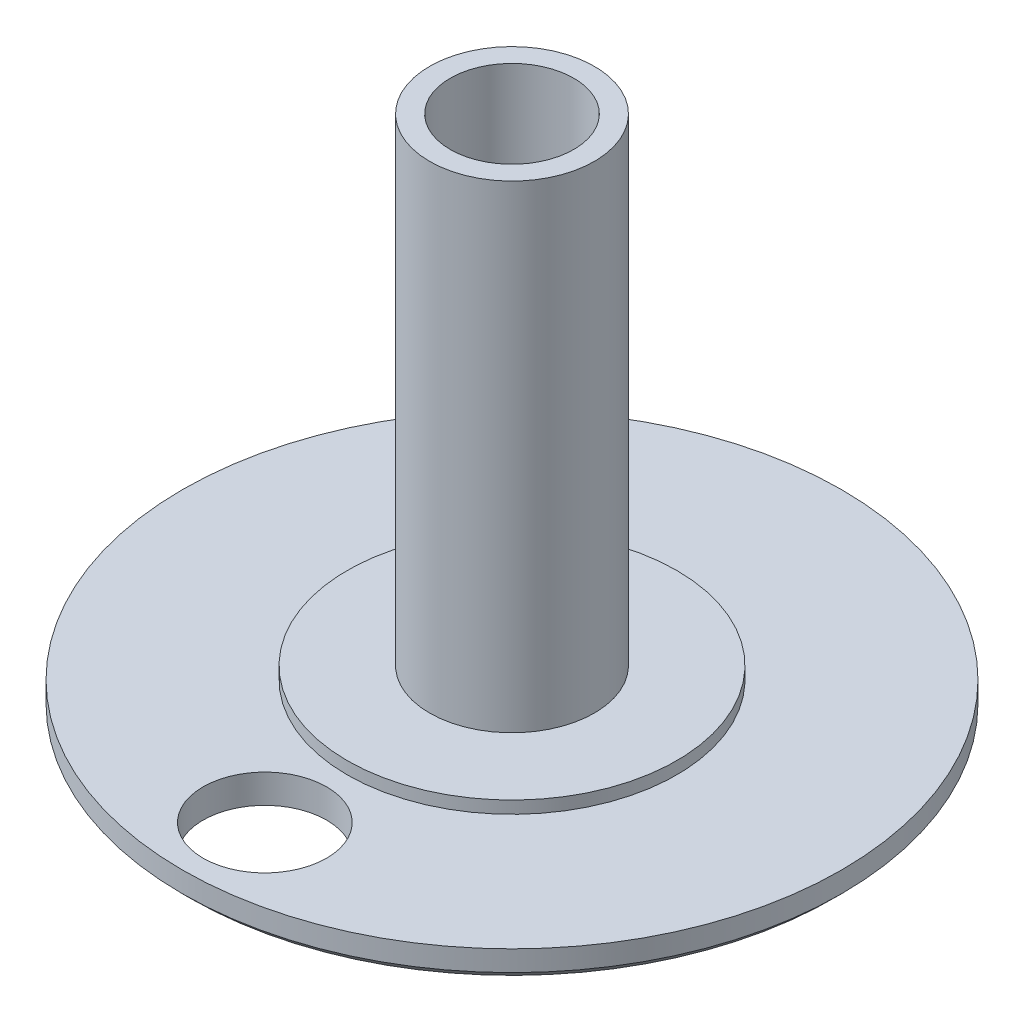
ISO-10303-21;
HEADER;
FILE_DESCRIPTION(('STEP AP214'),'2;1');
FILE_NAME('part.step','',(''),(''),'','','');
FILE_SCHEMA(('AUTOMOTIVE_DESIGN { 1 0 10303 214 1 1 1 1 }'));
ENDSEC;
DATA;
#1=APPLICATION_CONTEXT('core data for automotive mechanical design processes');
#2=APPLICATION_PROTOCOL_DEFINITION('international standard','automotive_design',2000,#1);
#3=PRODUCT_CONTEXT('',#1,'mechanical');
#4=PRODUCT('Part','Part','',(#3));
#5=PRODUCT_RELATED_PRODUCT_CATEGORY('part','',(#4));
#6=PRODUCT_DEFINITION_FORMATION('','',#4);
#7=PRODUCT_DEFINITION_CONTEXT('part definition',#1,'design');
#8=PRODUCT_DEFINITION('design','',#6,#7);
#9=PRODUCT_DEFINITION_SHAPE('','',#8);
#10=(LENGTH_UNIT() NAMED_UNIT(*) SI_UNIT(.MILLI.,.METRE.));
#11=(NAMED_UNIT(*) PLANE_ANGLE_UNIT() SI_UNIT($,.RADIAN.));
#12=(NAMED_UNIT(*) SI_UNIT($,.STERADIAN.) SOLID_ANGLE_UNIT());
#13=UNCERTAINTY_MEASURE_WITH_UNIT(LENGTH_MEASURE(1.E-05),#10,'distance_accuracy_value','');
#14=(GEOMETRIC_REPRESENTATION_CONTEXT(3) GLOBAL_UNCERTAINTY_ASSIGNED_CONTEXT((#13)) GLOBAL_UNIT_ASSIGNED_CONTEXT((#10,
#11,#12)) REPRESENTATION_CONTEXT('',''));
#15=CARTESIAN_POINT('',(0.,0.,0.));
#16=DIRECTION('',(0.,0.,1.));
#17=DIRECTION('',(1.,0.,0.));
#18=AXIS2_PLACEMENT_3D('',#15,#16,#17);
#19=CARTESIAN_POINT('',(0.,0.7,0.));
#20=DIRECTION('',(0.,-1.,0.));
#21=DIRECTION('',(0.,0.,-1.));
#22=AXIS2_PLACEMENT_3D('',#19,#20,#21);
#23=CYLINDRICAL_SURFACE('',#22,8.);
#24=CARTESIAN_POINT('',(0.,0.199999999999999,0.));
#25=DIRECTION('',(0.,1.,0.));
#26=DIRECTION('',(0.,0.,1.));
#27=AXIS2_PLACEMENT_3D('',#24,#25,#26);
#28=CIRCLE('',#27,8.);
#29=CARTESIAN_POINT('',(0.,0.199999999999999,8.));
#30=VERTEX_POINT('',#29);
#31=EDGE_CURVE('E43',#30,#30,#28,.T.);
#32=ORIENTED_EDGE('',*,*,#31,.T.);
#33=EDGE_LOOP('',(#32));
#34=FACE_BOUND('',#33,.T.);
#35=CARTESIAN_POINT('',(0.,0.7,0.));
#36=DIRECTION('',(0.,1.,0.));
#37=DIRECTION('',(0.,0.,1.));
#38=AXIS2_PLACEMENT_3D('',#35,#36,#37);
#39=CIRCLE('',#38,8.);
#40=CARTESIAN_POINT('',(0.,0.7,8.));
#41=VERTEX_POINT('',#40);
#42=EDGE_CURVE('E54',#41,#41,#39,.T.);
#43=ORIENTED_EDGE('',*,*,#42,.F.);
#44=EDGE_LOOP('',(#43));
#45=FACE_BOUND('',#44,.T.);
#46=ADVANCED_FACE('F35',(#34,#45),#23,.T.);
#47=CARTESIAN_POINT('',(0.,0.7,0.));
#48=DIRECTION('',(0.,1.,0.));
#49=DIRECTION('',(0.,0.,1.));
#50=AXIS2_PLACEMENT_3D('',#47,#48,#49);
#51=PLANE('',#50);
#52=CARTESIAN_POINT('',(0.,0.699999999999999,6.));
#53=DIRECTION('',(0.,1.,0.));
#54=DIRECTION('',(0.,0.,1.));
#55=AXIS2_PLACEMENT_3D('',#52,#53,#54);
#56=CIRCLE('',#55,1.5);
#57=CARTESIAN_POINT('',(0.,0.699999999999999,7.5));
#58=VERTEX_POINT('',#57);
#59=EDGE_CURVE('E69',#58,#58,#56,.T.);
#60=ORIENTED_EDGE('',*,*,#59,.F.);
#61=EDGE_LOOP('',(#60));
#62=FACE_BOUND('',#61,.T.);
#63=CARTESIAN_POINT('',(0.,0.7,0.));
#64=DIRECTION('',(0.,1.,0.));
#65=DIRECTION('',(0.,0.,1.));
#66=AXIS2_PLACEMENT_3D('',#63,#64,#65);
#67=CIRCLE('',#66,4.);
#68=CARTESIAN_POINT('',(0.,0.7,4.));
#69=VERTEX_POINT('',#68);
#70=EDGE_CURVE('E51',#69,#69,#67,.T.);
#71=ORIENTED_EDGE('',*,*,#70,.F.);
#72=EDGE_LOOP('',(#71));
#73=FACE_BOUND('',#72,.T.);
#74=ORIENTED_EDGE('',*,*,#42,.T.);
#75=EDGE_LOOP('',(#74));
#76=FACE_BOUND('',#75,.T.);
#77=ADVANCED_FACE('F83',(#62,#73,#76),#51,.T.);
#78=CARTESIAN_POINT('',(0.,0.,0.));
#79=DIRECTION('',(0.,1.,0.));
#80=DIRECTION('',(0.,0.,1.));
#81=AXIS2_PLACEMENT_3D('',#78,#79,#80);
#82=PLANE('',#81);
#83=CARTESIAN_POINT('',(0.,0.,0.));
#84=DIRECTION('',(0.,1.,0.));
#85=DIRECTION('',(0.,0.,1.));
#86=AXIS2_PLACEMENT_3D('',#83,#84,#85);
#87=CIRCLE('',#86,7.8);
#88=CARTESIAN_POINT('',(0.,0.,7.8));
#89=VERTEX_POINT('',#88);
#90=EDGE_CURVE('E10',#89,#89,#87,.F.);
#91=ORIENTED_EDGE('',*,*,#90,.T.);
#92=EDGE_LOOP('',(#91));
#93=FACE_BOUND('',#92,.T.);
#94=CARTESIAN_POINT('',(0.,0.,6.));
#95=DIRECTION('',(0.,-1.,0.));
#96=DIRECTION('',(0.,0.,-1.));
#97=AXIS2_PLACEMENT_3D('',#94,#95,#96);
#98=CIRCLE('',#97,1.5);
#99=CARTESIAN_POINT('',(0.,0.,4.5));
#100=VERTEX_POINT('',#99);
#101=EDGE_CURVE('E74',#100,#100,#98,.T.);
#102=ORIENTED_EDGE('',*,*,#101,.F.);
#103=EDGE_LOOP('',(#102));
#104=FACE_BOUND('',#103,.T.);
#105=ADVANCED_FACE('F80',(#93,#104),#82,.F.);
#106=CARTESIAN_POINT('',(0.,1.,0.));
#107=DIRECTION('',(0.,-1.,0.));
#108=DIRECTION('',(0.,0.,-1.));
#109=AXIS2_PLACEMENT_3D('',#106,#107,#108);
#110=CYLINDRICAL_SURFACE('',#109,4.);
#111=CARTESIAN_POINT('',(0.,1.,0.));
#112=DIRECTION('',(0.,1.,0.));
#113=DIRECTION('',(0.,0.,1.));
#114=AXIS2_PLACEMENT_3D('',#111,#112,#113);
#115=CIRCLE('',#114,4.);
#116=CARTESIAN_POINT('',(0.,1.,4.));
#117=VERTEX_POINT('',#116);
#118=EDGE_CURVE('E57',#117,#117,#115,.T.);
#119=ORIENTED_EDGE('',*,*,#118,.F.);
#120=EDGE_LOOP('',(#119));
#121=FACE_BOUND('',#120,.T.);
#122=ORIENTED_EDGE('',*,*,#70,.T.);
#123=EDGE_LOOP('',(#122));
#124=FACE_BOUND('',#123,.T.);
#125=ADVANCED_FACE('F82',(#121,#124),#110,.T.);
#126=CARTESIAN_POINT('',(0.,1.,0.));
#127=DIRECTION('',(0.,1.,0.));
#128=DIRECTION('',(0.,0.,1.));
#129=AXIS2_PLACEMENT_3D('',#126,#127,#128);
#130=PLANE('',#129);
#131=CARTESIAN_POINT('',(0.,1.,0.));
#132=DIRECTION('',(0.,1.,0.));
#133=DIRECTION('',(0.,0.,1.));
#134=AXIS2_PLACEMENT_3D('',#131,#132,#133);
#135=CIRCLE('',#134,2.);
#136=CARTESIAN_POINT('',(0.,1.,2.));
#137=VERTEX_POINT('',#136);
#138=EDGE_CURVE('E47',#137,#137,#135,.T.);
#139=ORIENTED_EDGE('',*,*,#138,.F.);
#140=EDGE_LOOP('',(#139));
#141=FACE_BOUND('',#140,.T.);
#142=ORIENTED_EDGE('',*,*,#118,.T.);
#143=EDGE_LOOP('',(#142));
#144=FACE_BOUND('',#143,.T.);
#145=ADVANCED_FACE('F89',(#141,#144),#130,.T.);
#146=CARTESIAN_POINT('',(0.,12.6,0.));
#147=DIRECTION('',(0.,-1.,0.));
#148=DIRECTION('',(0.,0.,-1.));
#149=AXIS2_PLACEMENT_3D('',#146,#147,#148);
#150=CYLINDRICAL_SURFACE('',#149,2.);
#151=CARTESIAN_POINT('',(0.,12.6,0.));
#152=DIRECTION('',(0.,1.,0.));
#153=DIRECTION('',(0.,0.,1.));
#154=AXIS2_PLACEMENT_3D('',#151,#152,#153);
#155=CIRCLE('',#154,2.);
#156=CARTESIAN_POINT('',(0.,12.6,2.));
#157=VERTEX_POINT('',#156);
#158=EDGE_CURVE('E61',#157,#157,#155,.T.);
#159=ORIENTED_EDGE('',*,*,#158,.F.);
#160=EDGE_LOOP('',(#159));
#161=FACE_BOUND('',#160,.T.);
#162=ORIENTED_EDGE('',*,*,#138,.T.);
#163=EDGE_LOOP('',(#162));
#164=FACE_BOUND('',#163,.T.);
#165=ADVANCED_FACE('F148',(#161,#164),#150,.T.);
#166=CARTESIAN_POINT('',(0.,12.6,0.));
#167=DIRECTION('',(0.,1.,0.));
#168=DIRECTION('',(0.,0.,1.));
#169=AXIS2_PLACEMENT_3D('',#166,#167,#168);
#170=PLANE('',#169);
#171=CARTESIAN_POINT('',(0.,12.6,0.));
#172=DIRECTION('',(0.,1.,0.));
#173=DIRECTION('',(0.,0.,1.));
#174=AXIS2_PLACEMENT_3D('',#171,#172,#173);
#175=CIRCLE('',#174,1.5);
#176=CARTESIAN_POINT('',(0.,12.6,1.5));
#177=VERTEX_POINT('',#176);
#178=EDGE_CURVE('E66',#177,#177,#175,.T.);
#179=ORIENTED_EDGE('',*,*,#178,.F.);
#180=EDGE_LOOP('',(#179));
#181=FACE_BOUND('',#180,.T.);
#182=ORIENTED_EDGE('',*,*,#158,.T.);
#183=EDGE_LOOP('',(#182));
#184=FACE_BOUND('',#183,.T.);
#185=ADVANCED_FACE('F157',(#181,#184),#170,.T.);
#186=CARTESIAN_POINT('',(0.,4.1,0.));
#187=DIRECTION('',(0.,1.,0.));
#188=DIRECTION('',(0.,0.,1.));
#189=AXIS2_PLACEMENT_3D('',#186,#187,#188);
#190=CYLINDRICAL_SURFACE('',#189,1.5);
#191=CARTESIAN_POINT('',(0.,4.1,0.));
#192=DIRECTION('',(0.,1.,0.));
#193=DIRECTION('',(0.,0.,1.));
#194=AXIS2_PLACEMENT_3D('',#191,#192,#193);
#195=CIRCLE('',#194,1.5);
#196=CARTESIAN_POINT('',(0.,4.1,1.5));
#197=VERTEX_POINT('',#196);
#198=EDGE_CURVE('E65',#197,#197,#195,.T.);
#199=ORIENTED_EDGE('',*,*,#198,.F.);
#200=EDGE_LOOP('',(#199));
#201=FACE_BOUND('',#200,.T.);
#202=ORIENTED_EDGE('',*,*,#178,.T.);
#203=EDGE_LOOP('',(#202));
#204=FACE_BOUND('',#203,.T.);
#205=ADVANCED_FACE('F166',(#201,#204),#190,.F.);
#206=CARTESIAN_POINT('',(0.,4.1,0.));
#207=DIRECTION('',(0.,1.,0.));
#208=DIRECTION('',(0.,0.,1.));
#209=AXIS2_PLACEMENT_3D('',#206,#207,#208);
#210=PLANE('',#209);
#211=ORIENTED_EDGE('',*,*,#198,.T.);
#212=EDGE_LOOP('',(#211));
#213=FACE_BOUND('',#212,.T.);
#214=ADVANCED_FACE('F111',(#213),#210,.T.);
#215=CARTESIAN_POINT('',(0.,12.6,6.));
#216=DIRECTION('',(0.,-1.,0.));
#217=DIRECTION('',(0.,0.,-1.));
#218=AXIS2_PLACEMENT_3D('',#215,#216,#217);
#219=CYLINDRICAL_SURFACE('',#218,1.5);
#220=ORIENTED_EDGE('',*,*,#59,.T.);
#221=EDGE_LOOP('',(#220));
#222=FACE_BOUND('',#221,.T.);
#223=ORIENTED_EDGE('',*,*,#101,.T.);
#224=EDGE_LOOP('',(#223));
#225=FACE_BOUND('',#224,.T.);
#226=ADVANCED_FACE('F78',(#222,#225),#219,.F.);
#227=CARTESIAN_POINT('',(0.,0.199999999999999,0.));
#228=DIRECTION('',(0.,1.,0.));
#229=DIRECTION('',(0.,0.,1.));
#230=AXIS2_PLACEMENT_3D('',#227,#228,#229);
#231=CONICAL_SURFACE('',#230,8.,0.785398163397453);
#232=ORIENTED_EDGE('',*,*,#90,.F.);
#233=EDGE_LOOP('',(#232));
#234=FACE_BOUND('',#233,.T.);
#235=ORIENTED_EDGE('',*,*,#31,.F.);
#236=EDGE_LOOP('',(#235));
#237=FACE_BOUND('',#236,.T.);
#238=ADVANCED_FACE('F38',(#234,#237),#231,.T.);
#239=CLOSED_SHELL('',(#46,#77,#105,#125,#145,#165,#185,#205,#214,#226,#238));
#240=MANIFOLD_SOLID_BREP('B2',#239);
#241=ADVANCED_BREP_SHAPE_REPRESENTATION('',(#18,#240),#14);
#242=SHAPE_DEFINITION_REPRESENTATION(#9,#241);
ENDSEC;
END-ISO-10303-21;
